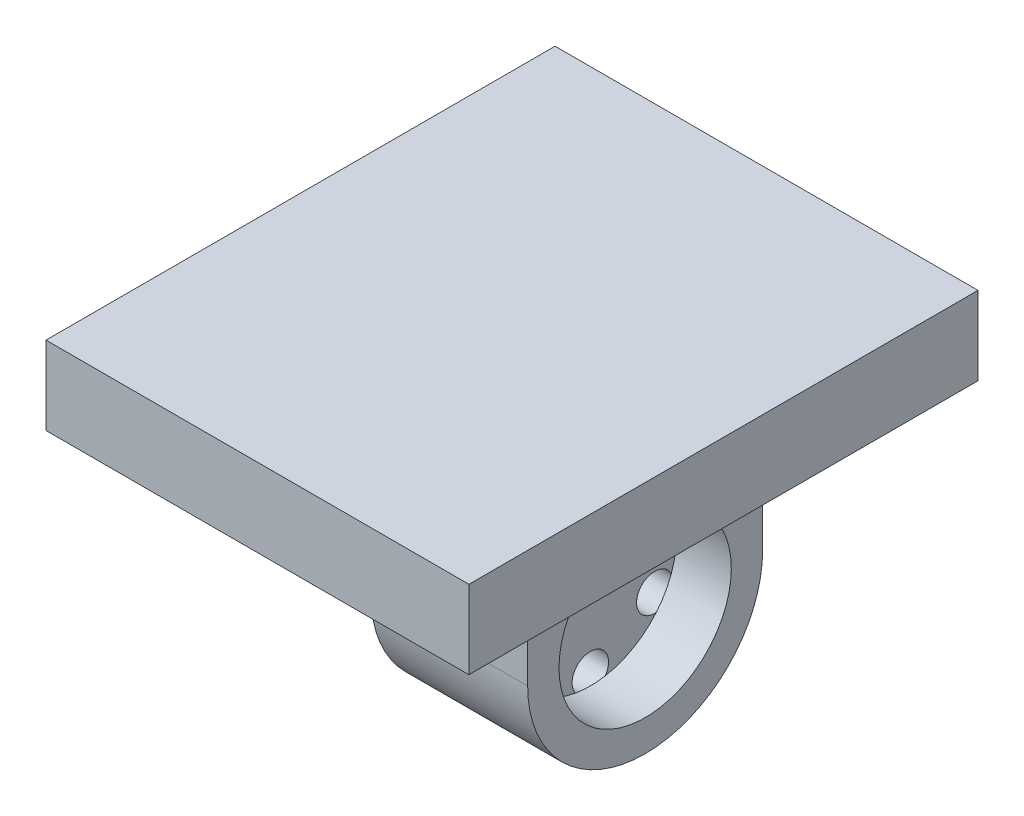
ISO-10303-21;
HEADER;
FILE_DESCRIPTION(('STEP AP214'),'2;1');
FILE_NAME('part.step','',(''),(''),'','','');
FILE_SCHEMA(('AUTOMOTIVE_DESIGN { 1 0 10303 214 1 1 1 1 }'));
ENDSEC;
DATA;
#1=APPLICATION_CONTEXT('core data for automotive mechanical design processes');
#2=APPLICATION_PROTOCOL_DEFINITION('international standard','automotive_design',2000,#1);
#3=PRODUCT_CONTEXT('',#1,'mechanical');
#4=PRODUCT('Part','Part','',(#3));
#5=PRODUCT_RELATED_PRODUCT_CATEGORY('part','',(#4));
#6=PRODUCT_DEFINITION_FORMATION('','',#4);
#7=PRODUCT_DEFINITION_CONTEXT('part definition',#1,'design');
#8=PRODUCT_DEFINITION('design','',#6,#7);
#9=PRODUCT_DEFINITION_SHAPE('','',#8);
#10=(LENGTH_UNIT() NAMED_UNIT(*) SI_UNIT(.MILLI.,.METRE.));
#11=(NAMED_UNIT(*) PLANE_ANGLE_UNIT() SI_UNIT($,.RADIAN.));
#12=(NAMED_UNIT(*) SI_UNIT($,.STERADIAN.) SOLID_ANGLE_UNIT());
#13=UNCERTAINTY_MEASURE_WITH_UNIT(LENGTH_MEASURE(1.E-05),#10,'distance_accuracy_value','');
#14=(GEOMETRIC_REPRESENTATION_CONTEXT(3) GLOBAL_UNCERTAINTY_ASSIGNED_CONTEXT((#13)) GLOBAL_UNIT_ASSIGNED_CONTEXT((#10,
#11,#12)) REPRESENTATION_CONTEXT('',''));
#15=CARTESIAN_POINT('',(0.,0.,0.));
#16=DIRECTION('',(0.,0.,1.));
#17=DIRECTION('',(1.,0.,0.));
#18=AXIS2_PLACEMENT_3D('',#15,#16,#17);
#19=CARTESIAN_POINT('',(0.,0.,0.));
#20=DIRECTION('',(0.,-1.,0.));
#21=DIRECTION('',(0.,0.,-1.));
#22=AXIS2_PLACEMENT_3D('',#19,#20,#21);
#23=PLANE('',#22);
#24=DIRECTION('',(0.,0.,-1.));
#25=VECTOR('',#24,1.);
#26=CARTESIAN_POINT('',(27.,0.,32.5));
#27=LINE('',#26,#25);
#28=CARTESIAN_POINT('',(27.,0.,32.5));
#29=VERTEX_POINT('',#28);
#30=CARTESIAN_POINT('',(27.,0.,-32.5));
#31=VERTEX_POINT('',#30);
#32=EDGE_CURVE('E281',#29,#31,#27,.T.);
#33=ORIENTED_EDGE('',*,*,#32,.F.);
#34=DIRECTION('',(1.,0.,0.));
#35=VECTOR('',#34,1.);
#36=CARTESIAN_POINT('',(-27.,0.,32.5));
#37=LINE('',#36,#35);
#38=CARTESIAN_POINT('',(-27.,0.,32.5));
#39=VERTEX_POINT('',#38);
#40=EDGE_CURVE('E291',#39,#29,#37,.T.);
#41=ORIENTED_EDGE('',*,*,#40,.F.);
#42=DIRECTION('',(0.,0.,1.));
#43=VECTOR('',#42,1.);
#44=CARTESIAN_POINT('',(-27.,0.,32.5));
#45=LINE('',#44,#43);
#46=CARTESIAN_POINT('',(-27.,0.,-32.5));
#47=VERTEX_POINT('',#46);
#48=EDGE_CURVE('E302',#47,#39,#45,.T.);
#49=ORIENTED_EDGE('',*,*,#48,.F.);
#50=DIRECTION('',(-1.,0.,0.));
#51=VECTOR('',#50,1.);
#52=CARTESIAN_POINT('',(-27.,0.,-32.5));
#53=LINE('',#52,#51);
#54=EDGE_CURVE('E300',#31,#47,#53,.T.);
#55=ORIENTED_EDGE('',*,*,#54,.F.);
#56=EDGE_LOOP('',(#33,#41,#49,#55));
#57=FACE_BOUND('',#56,.T.);
#58=DIRECTION('',(0.,0.,-1.));
#59=VECTOR('',#58,1.);
#60=CARTESIAN_POINT('',(-3.00000000000001,0.,15.));
#61=LINE('',#60,#59);
#62=CARTESIAN_POINT('',(-3.00000000000001,0.,15.));
#63=VERTEX_POINT('',#62);
#64=CARTESIAN_POINT('',(-3.,0.,-15.));
#65=VERTEX_POINT('',#64);
#66=EDGE_CURVE('E273',#63,#65,#61,.T.);
#67=ORIENTED_EDGE('',*,*,#66,.F.);
#68=DIRECTION('',(-1.,0.,0.));
#69=VECTOR('',#68,1.);
#70=CARTESIAN_POINT('',(-3.00000000000001,0.,15.));
#71=LINE('',#70,#69);
#72=CARTESIAN_POINT('',(17.,0.,15.));
#73=VERTEX_POINT('',#72);
#74=EDGE_CURVE('E328',#73,#63,#71,.T.);
#75=ORIENTED_EDGE('',*,*,#74,.F.);
#76=DIRECTION('',(0.,0.,1.));
#77=VECTOR('',#76,1.);
#78=CARTESIAN_POINT('',(17.,0.,15.));
#79=LINE('',#78,#77);
#80=CARTESIAN_POINT('',(17.,0.,-15.));
#81=VERTEX_POINT('',#80);
#82=EDGE_CURVE('E433',#81,#73,#79,.T.);
#83=ORIENTED_EDGE('',*,*,#82,.F.);
#84=DIRECTION('',(1.,0.,0.));
#85=VECTOR('',#84,1.);
#86=CARTESIAN_POINT('',(-3.,0.,-15.));
#87=LINE('',#86,#85);
#88=EDGE_CURVE('E428',#65,#81,#87,.T.);
#89=ORIENTED_EDGE('',*,*,#88,.F.);
#90=EDGE_LOOP('',(#67,#75,#83,#89));
#91=FACE_BOUND('',#90,.T.);
#92=ADVANCED_FACE('F34',(#57,#91),#23,.T.);
#93=CARTESIAN_POINT('',(27.,10.,32.5));
#94=DIRECTION('',(-1.,0.,0.));
#95=DIRECTION('',(0.,0.,1.));
#96=AXIS2_PLACEMENT_3D('',#93,#94,#95);
#97=PLANE('',#96);
#98=ORIENTED_EDGE('',*,*,#32,.T.);
#99=DIRECTION('',(0.,-1.,0.));
#100=VECTOR('',#99,1.);
#101=CARTESIAN_POINT('',(27.,10.,-32.5));
#102=LINE('',#101,#100);
#103=CARTESIAN_POINT('',(27.,10.,-32.5));
#104=VERTEX_POINT('',#103);
#105=EDGE_CURVE('E313',#104,#31,#102,.T.);
#106=ORIENTED_EDGE('',*,*,#105,.F.);
#107=DIRECTION('',(0.,0.,-1.));
#108=VECTOR('',#107,1.);
#109=CARTESIAN_POINT('',(27.,10.,32.5));
#110=LINE('',#109,#108);
#111=CARTESIAN_POINT('',(27.,10.,32.5));
#112=VERTEX_POINT('',#111);
#113=EDGE_CURVE('E287',#112,#104,#110,.T.);
#114=ORIENTED_EDGE('',*,*,#113,.F.);
#115=DIRECTION('',(0.,-1.,0.));
#116=VECTOR('',#115,1.);
#117=CARTESIAN_POINT('',(27.,10.,32.5));
#118=LINE('',#117,#116);
#119=EDGE_CURVE('E297',#112,#29,#118,.T.);
#120=ORIENTED_EDGE('',*,*,#119,.T.);
#121=EDGE_LOOP('',(#98,#106,#114,#120));
#122=FACE_BOUND('',#121,.T.);
#123=ADVANCED_FACE('F389',(#122),#97,.F.);
#124=CARTESIAN_POINT('',(-27.,10.,-32.5));
#125=DIRECTION('',(0.,0.,1.));
#126=DIRECTION('',(1.,0.,0.));
#127=AXIS2_PLACEMENT_3D('',#124,#125,#126);
#128=PLANE('',#127);
#129=ORIENTED_EDGE('',*,*,#54,.T.);
#130=DIRECTION('',(0.,-1.,0.));
#131=VECTOR('',#130,1.);
#132=CARTESIAN_POINT('',(-27.,10.,-32.5));
#133=LINE('',#132,#131);
#134=CARTESIAN_POINT('',(-27.,10.,-32.5));
#135=VERTEX_POINT('',#134);
#136=EDGE_CURVE('E310',#135,#47,#133,.T.);
#137=ORIENTED_EDGE('',*,*,#136,.F.);
#138=DIRECTION('',(-1.,0.,0.));
#139=VECTOR('',#138,1.);
#140=CARTESIAN_POINT('',(-27.,10.,-32.5));
#141=LINE('',#140,#139);
#142=EDGE_CURVE('E290',#104,#135,#141,.T.);
#143=ORIENTED_EDGE('',*,*,#142,.F.);
#144=ORIENTED_EDGE('',*,*,#105,.T.);
#145=EDGE_LOOP('',(#129,#137,#143,#144));
#146=FACE_BOUND('',#145,.T.);
#147=ADVANCED_FACE('F395',(#146),#128,.F.);
#148=CARTESIAN_POINT('',(-27.,10.,32.5));
#149=DIRECTION('',(1.,0.,0.));
#150=DIRECTION('',(0.,0.,-1.));
#151=AXIS2_PLACEMENT_3D('',#148,#149,#150);
#152=PLANE('',#151);
#153=ORIENTED_EDGE('',*,*,#48,.T.);
#154=DIRECTION('',(0.,-1.,0.));
#155=VECTOR('',#154,1.);
#156=CARTESIAN_POINT('',(-27.,10.,32.5));
#157=LINE('',#156,#155);
#158=CARTESIAN_POINT('',(-27.,10.,32.5));
#159=VERTEX_POINT('',#158);
#160=EDGE_CURVE('E307',#159,#39,#157,.T.);
#161=ORIENTED_EDGE('',*,*,#160,.F.);
#162=DIRECTION('',(0.,0.,1.));
#163=VECTOR('',#162,1.);
#164=CARTESIAN_POINT('',(-27.,10.,32.5));
#165=LINE('',#164,#163);
#166=EDGE_CURVE('E293',#135,#159,#165,.T.);
#167=ORIENTED_EDGE('',*,*,#166,.F.);
#168=ORIENTED_EDGE('',*,*,#136,.T.);
#169=EDGE_LOOP('',(#153,#161,#167,#168));
#170=FACE_BOUND('',#169,.T.);
#171=ADVANCED_FACE('F407',(#170),#152,.F.);
#172=CARTESIAN_POINT('',(-27.,10.,32.5));
#173=DIRECTION('',(0.,0.,-1.));
#174=DIRECTION('',(-1.,0.,0.));
#175=AXIS2_PLACEMENT_3D('',#172,#173,#174);
#176=PLANE('',#175);
#177=ORIENTED_EDGE('',*,*,#40,.T.);
#178=ORIENTED_EDGE('',*,*,#119,.F.);
#179=DIRECTION('',(1.,0.,0.));
#180=VECTOR('',#179,1.);
#181=CARTESIAN_POINT('',(-27.,10.,32.5));
#182=LINE('',#181,#180);
#183=EDGE_CURVE('E295',#159,#112,#182,.T.);
#184=ORIENTED_EDGE('',*,*,#183,.F.);
#185=ORIENTED_EDGE('',*,*,#160,.T.);
#186=EDGE_LOOP('',(#177,#178,#184,#185));
#187=FACE_BOUND('',#186,.T.);
#188=ADVANCED_FACE('F404',(#187),#176,.F.);
#189=CARTESIAN_POINT('',(0.,10.,0.));
#190=DIRECTION('',(0.,-1.,0.));
#191=DIRECTION('',(0.,0.,-1.));
#192=AXIS2_PLACEMENT_3D('',#189,#190,#191);
#193=PLANE('',#192);
#194=ORIENTED_EDGE('',*,*,#113,.T.);
#195=ORIENTED_EDGE('',*,*,#142,.T.);
#196=ORIENTED_EDGE('',*,*,#166,.T.);
#197=ORIENTED_EDGE('',*,*,#183,.T.);
#198=EDGE_LOOP('',(#194,#195,#196,#197));
#199=FACE_BOUND('',#198,.T.);
#200=ADVANCED_FACE('F402',(#199),#193,.F.);
#201=CARTESIAN_POINT('',(-3.00000000000001,-30.,15.));
#202=DIRECTION('',(0.,0.,-1.));
#203=DIRECTION('',(-1.,0.,0.));
#204=AXIS2_PLACEMENT_3D('',#201,#202,#203);
#205=PLANE('',#204);
#206=DIRECTION('',(0.,1.,0.));
#207=VECTOR('',#206,1.);
#208=CARTESIAN_POINT('',(-3.00000000000001,-30.,15.));
#209=LINE('',#208,#207);
#210=CARTESIAN_POINT('',(-3.00000000000001,-15.,15.));
#211=VERTEX_POINT('',#210);
#212=EDGE_CURVE('E278',#211,#63,#209,.T.);
#213=ORIENTED_EDGE('',*,*,#212,.F.);
#214=DIRECTION('',(-1.,0.,0.));
#215=VECTOR('',#214,1.);
#216=CARTESIAN_POINT('',(-3.00000000000001,-15.,15.));
#217=LINE('',#216,#215);
#218=CARTESIAN_POINT('',(17.,-15.,15.));
#219=VERTEX_POINT('',#218);
#220=EDGE_CURVE('E325',#211,#219,#217,.F.);
#221=ORIENTED_EDGE('',*,*,#220,.T.);
#222=DIRECTION('',(0.,1.,0.));
#223=VECTOR('',#222,1.);
#224=CARTESIAN_POINT('',(17.,-30.,15.));
#225=LINE('',#224,#223);
#226=EDGE_CURVE('E283',#219,#73,#225,.T.);
#227=ORIENTED_EDGE('',*,*,#226,.T.);
#228=ORIENTED_EDGE('',*,*,#74,.T.);
#229=EDGE_LOOP('',(#213,#221,#227,#228));
#230=FACE_BOUND('',#229,.T.);
#231=ADVANCED_FACE('F264',(#230),#205,.F.);
#232=CARTESIAN_POINT('',(-3.00000000000001,-30.,15.));
#233=DIRECTION('',(1.,0.,0.));
#234=DIRECTION('',(0.,0.,-1.));
#235=AXIS2_PLACEMENT_3D('',#232,#233,#234);
#236=PLANE('',#235);
#237=CARTESIAN_POINT('',(-3.,-10.2500000000003,-8.22724133595191));
#238=DIRECTION('',(-1.,0.,0.));
#239=DIRECTION('',(0.,0.,1.));
#240=AXIS2_PLACEMENT_3D('',#237,#238,#239);
#241=CIRCLE('',#240,1.5875);
#242=CARTESIAN_POINT('',(-3.,-10.2500000000003,-6.63974133595191));
#243=VERTEX_POINT('',#242);
#244=EDGE_CURVE('E235',#243,#243,#241,.T.);
#245=ORIENTED_EDGE('',*,*,#244,.F.);
#246=EDGE_LOOP('',(#245));
#247=FACE_BOUND('',#246,.T.);
#248=CARTESIAN_POINT('',(-3.,-19.7500000000003,-8.22724133595161));
#249=DIRECTION('',(-1.,0.,0.));
#250=DIRECTION('',(0.,0.,1.));
#251=AXIS2_PLACEMENT_3D('',#248,#249,#250);
#252=CIRCLE('',#251,1.5875);
#253=CARTESIAN_POINT('',(-3.,-19.7500000000003,-6.63974133595161));
#254=VERTEX_POINT('',#253);
#255=EDGE_CURVE('E238',#254,#254,#252,.T.);
#256=ORIENTED_EDGE('',*,*,#255,.F.);
#257=EDGE_LOOP('',(#256));
#258=FACE_BOUND('',#257,.T.);
#259=CARTESIAN_POINT('',(-3.,-24.5,7.40190329950925E-13));
#260=DIRECTION('',(-1.,0.,0.));
#261=DIRECTION('',(0.,0.,1.));
#262=AXIS2_PLACEMENT_3D('',#259,#260,#261);
#263=CIRCLE('',#262,1.5875);
#264=CARTESIAN_POINT('',(-3.,-24.5,1.58750000000074));
#265=VERTEX_POINT('',#264);
#266=EDGE_CURVE('E241',#265,#265,#263,.T.);
#267=ORIENTED_EDGE('',*,*,#266,.F.);
#268=EDGE_LOOP('',(#267));
#269=FACE_BOUND('',#268,.T.);
#270=CARTESIAN_POINT('',(-3.,-19.7499999999997,8.22724133595275));
#271=DIRECTION('',(-1.,0.,0.));
#272=DIRECTION('',(0.,0.,1.));
#273=AXIS2_PLACEMENT_3D('',#270,#271,#272);
#274=CIRCLE('',#273,1.5875);
#275=CARTESIAN_POINT('',(-3.,-19.7499999999997,9.81474133595275));
#276=VERTEX_POINT('',#275);
#277=EDGE_CURVE('E244',#276,#276,#274,.T.);
#278=ORIENTED_EDGE('',*,*,#277,.F.);
#279=EDGE_LOOP('',(#278));
#280=FACE_BOUND('',#279,.T.);
#281=CARTESIAN_POINT('',(-3.,-10.2499999999997,8.22724133595238));
#282=DIRECTION('',(-1.,0.,0.));
#283=DIRECTION('',(0.,0.,1.));
#284=AXIS2_PLACEMENT_3D('',#281,#282,#283);
#285=CIRCLE('',#284,1.5875);
#286=CARTESIAN_POINT('',(-3.,-10.2499999999997,9.81474133595238));
#287=VERTEX_POINT('',#286);
#288=EDGE_CURVE('E247',#287,#287,#285,.T.);
#289=ORIENTED_EDGE('',*,*,#288,.F.);
#290=EDGE_LOOP('',(#289));
#291=FACE_BOUND('',#290,.T.);
#292=CARTESIAN_POINT('',(-3.,-5.5,0.));
#293=DIRECTION('',(-1.,0.,0.));
#294=DIRECTION('',(0.,0.,1.));
#295=AXIS2_PLACEMENT_3D('',#292,#293,#294);
#296=CIRCLE('',#295,1.5875);
#297=CARTESIAN_POINT('',(-3.,-5.5,1.5875));
#298=VERTEX_POINT('',#297);
#299=EDGE_CURVE('E250',#298,#298,#296,.T.);
#300=ORIENTED_EDGE('',*,*,#299,.F.);
#301=EDGE_LOOP('',(#300));
#302=FACE_BOUND('',#301,.T.);
#303=CARTESIAN_POINT('',(-3.,-15.,0.));
#304=DIRECTION('',(-1.,0.,0.));
#305=DIRECTION('',(0.,0.,1.));
#306=AXIS2_PLACEMENT_3D('',#303,#304,#305);
#307=CIRCLE('',#306,6.);
#308=CARTESIAN_POINT('',(-3.,-15.,6.));
#309=VERTEX_POINT('',#308);
#310=EDGE_CURVE('E253',#309,#309,#307,.T.);
#311=ORIENTED_EDGE('',*,*,#310,.F.);
#312=EDGE_LOOP('',(#311));
#313=FACE_BOUND('',#312,.T.);
#314=DIRECTION('',(0.,1.,0.));
#315=VECTOR('',#314,1.);
#316=CARTESIAN_POINT('',(-3.,-30.,-15.));
#317=LINE('',#316,#315);
#318=CARTESIAN_POINT('',(-3.,-15.,-15.));
#319=VERTEX_POINT('',#318);
#320=EDGE_CURVE('E269',#319,#65,#317,.T.);
#321=ORIENTED_EDGE('',*,*,#320,.F.);
#322=CARTESIAN_POINT('',(-3.,-15.,0.));
#323=DIRECTION('',(1.,0.,0.));
#324=DIRECTION('',(0.,0.,-1.));
#325=AXIS2_PLACEMENT_3D('',#322,#323,#324);
#326=CIRCLE('',#325,15.);
#327=CARTESIAN_POINT('',(-3.,-30.,0.));
#328=VERTEX_POINT('',#327);
#329=EDGE_CURVE('E270',#319,#328,#326,.F.);
#330=ORIENTED_EDGE('',*,*,#329,.T.);
#331=CARTESIAN_POINT('',(-3.,-15.,0.));
#332=DIRECTION('',(1.,0.,0.));
#333=DIRECTION('',(0.,0.,-1.));
#334=AXIS2_PLACEMENT_3D('',#331,#332,#333);
#335=CIRCLE('',#334,15.);
#336=EDGE_CURVE('E322',#328,#211,#335,.F.);
#337=ORIENTED_EDGE('',*,*,#336,.T.);
#338=ORIENTED_EDGE('',*,*,#212,.T.);
#339=ORIENTED_EDGE('',*,*,#66,.T.);
#340=EDGE_LOOP('',(#321,#330,#337,#338,#339));
#341=FACE_BOUND('',#340,.T.);
#342=ADVANCED_FACE('F260',(#247,#258,#269,#280,#291,#302,#313,#341),#236,.F.);
#343=CARTESIAN_POINT('',(-3.,-30.,-15.));
#344=DIRECTION('',(0.,0.,1.));
#345=DIRECTION('',(1.,0.,0.));
#346=AXIS2_PLACEMENT_3D('',#343,#344,#345);
#347=PLANE('',#346);
#348=DIRECTION('',(0.,1.,0.));
#349=VECTOR('',#348,1.);
#350=CARTESIAN_POINT('',(17.,-30.,-15.));
#351=LINE('',#350,#349);
#352=CARTESIAN_POINT('',(17.,-15.,-15.));
#353=VERTEX_POINT('',#352);
#354=EDGE_CURVE('E279',#353,#81,#351,.T.);
#355=ORIENTED_EDGE('',*,*,#354,.F.);
#356=DIRECTION('',(1.,0.,0.));
#357=VECTOR('',#356,1.);
#358=CARTESIAN_POINT('',(-3.,-15.,-15.));
#359=LINE('',#358,#357);
#360=EDGE_CURVE('E320',#353,#319,#359,.F.);
#361=ORIENTED_EDGE('',*,*,#360,.T.);
#362=ORIENTED_EDGE('',*,*,#320,.T.);
#363=ORIENTED_EDGE('',*,*,#88,.T.);
#364=EDGE_LOOP('',(#355,#361,#362,#363));
#365=FACE_BOUND('',#364,.T.);
#366=ADVANCED_FACE('F263',(#365),#347,.F.);
#367=CARTESIAN_POINT('',(17.,-30.,15.));
#368=DIRECTION('',(-1.,0.,0.));
#369=DIRECTION('',(0.,0.,1.));
#370=AXIS2_PLACEMENT_3D('',#367,#368,#369);
#371=PLANE('',#370);
#372=CARTESIAN_POINT('',(17.,-15.,0.));
#373=DIRECTION('',(1.,0.,0.));
#374=DIRECTION('',(0.,0.,-1.));
#375=AXIS2_PLACEMENT_3D('',#372,#373,#374);
#376=CIRCLE('',#375,11.);
#377=CARTESIAN_POINT('',(17.,-15.,-11.));
#378=VERTEX_POINT('',#377);
#379=EDGE_CURVE('E178',#378,#378,#376,.T.);
#380=ORIENTED_EDGE('',*,*,#379,.F.);
#381=EDGE_LOOP('',(#380));
#382=FACE_BOUND('',#381,.T.);
#383=CARTESIAN_POINT('',(17.,-15.,0.));
#384=DIRECTION('',(-1.,0.,0.));
#385=DIRECTION('',(0.,0.,1.));
#386=AXIS2_PLACEMENT_3D('',#383,#384,#385);
#387=CIRCLE('',#386,15.);
#388=CARTESIAN_POINT('',(17.,-30.,0.));
#389=VERTEX_POINT('',#388);
#390=EDGE_CURVE('E316',#219,#389,#387,.F.);
#391=ORIENTED_EDGE('',*,*,#390,.T.);
#392=CARTESIAN_POINT('',(17.,-15.,0.));
#393=DIRECTION('',(-1.,0.,0.));
#394=DIRECTION('',(0.,0.,1.));
#395=AXIS2_PLACEMENT_3D('',#392,#393,#394);
#396=CIRCLE('',#395,15.);
#397=EDGE_CURVE('E318',#389,#353,#396,.F.);
#398=ORIENTED_EDGE('',*,*,#397,.T.);
#399=ORIENTED_EDGE('',*,*,#354,.T.);
#400=ORIENTED_EDGE('',*,*,#82,.T.);
#401=ORIENTED_EDGE('',*,*,#226,.F.);
#402=EDGE_LOOP('',(#391,#398,#399,#400,#401));
#403=FACE_BOUND('',#402,.T.);
#404=ADVANCED_FACE('F422',(#382,#403),#371,.F.);
#405=CARTESIAN_POINT('',(0.,-15.,0.));
#406=DIRECTION('',(-1.,0.,0.));
#407=DIRECTION('',(0.,0.,1.));
#408=AXIS2_PLACEMENT_3D('',#405,#406,#407);
#409=CYLINDRICAL_SURFACE('',#408,15.);
#410=ORIENTED_EDGE('',*,*,#220,.F.);
#411=ORIENTED_EDGE('',*,*,#336,.F.);
#412=DIRECTION('',(-1.,0.,0.));
#413=VECTOR('',#412,1.);
#414=CARTESIAN_POINT('',(0.,-30.,0.));
#415=LINE('',#414,#413);
#416=EDGE_CURVE('E166',#389,#328,#415,.T.);
#417=ORIENTED_EDGE('',*,*,#416,.F.);
#418=ORIENTED_EDGE('',*,*,#390,.F.);
#419=EDGE_LOOP('',(#410,#411,#417,#418));
#420=FACE_BOUND('',#419,.T.);
#421=ADVANCED_FACE('F36',(#420),#409,.T.);
#422=CARTESIAN_POINT('',(0.,-15.,0.));
#423=DIRECTION('',(1.,0.,0.));
#424=DIRECTION('',(0.,0.,-1.));
#425=AXIS2_PLACEMENT_3D('',#422,#423,#424);
#426=CYLINDRICAL_SURFACE('',#425,15.);
#427=ORIENTED_EDGE('',*,*,#329,.F.);
#428=ORIENTED_EDGE('',*,*,#360,.F.);
#429=ORIENTED_EDGE('',*,*,#397,.F.);
#430=ORIENTED_EDGE('',*,*,#416,.T.);
#431=EDGE_LOOP('',(#427,#428,#429,#430));
#432=FACE_BOUND('',#431,.T.);
#433=ADVANCED_FACE('F414',(#432),#426,.T.);
#434=CARTESIAN_POINT('',(10.,-15.,0.));
#435=DIRECTION('',(1.,0.,0.));
#436=DIRECTION('',(0.,0.,-1.));
#437=AXIS2_PLACEMENT_3D('',#434,#435,#436);
#438=CYLINDRICAL_SURFACE('',#437,11.);
#439=CARTESIAN_POINT('',(10.,-15.,0.));
#440=DIRECTION('',(1.,0.,0.));
#441=DIRECTION('',(0.,0.,-1.));
#442=AXIS2_PLACEMENT_3D('',#439,#440,#441);
#443=CIRCLE('',#442,11.);
#444=CARTESIAN_POINT('',(10.,-4.16586530578947,-1.90303059032265));
#445=VERTEX_POINT('',#444);
#446=CARTESIAN_POINT('',(10.,-4.16586530578947,1.90303059032265));
#447=VERTEX_POINT('',#446);
#448=EDGE_CURVE('E163',#445,#447,#443,.T.);
#449=ORIENTED_EDGE('',*,*,#448,.F.);
#450=CARTESIAN_POINT('',(10.,-7.93485981749605,-8.43112057804702));
#451=VERTEX_POINT('',#450);
#452=EDGE_CURVE('E171',#451,#445,#443,.T.);
#453=ORIENTED_EDGE('',*,*,#452,.F.);
#454=CARTESIAN_POINT('',(10.,-11.2310054882931,-10.33415116837));
#455=VERTEX_POINT('',#454);
#456=EDGE_CURVE('E164',#455,#451,#443,.T.);
#457=ORIENTED_EDGE('',*,*,#456,.F.);
#458=CARTESIAN_POINT('',(10.,-18.7689945117061,-10.3341511683703));
#459=VERTEX_POINT('',#458);
#460=EDGE_CURVE('E170',#459,#455,#443,.T.);
#461=ORIENTED_EDGE('',*,*,#460,.F.);
#462=CARTESIAN_POINT('',(10.,-22.0651401825033,-8.43112057804757));
#463=VERTEX_POINT('',#462);
#464=EDGE_CURVE('E176',#463,#459,#443,.T.);
#465=ORIENTED_EDGE('',*,*,#464,.F.);
#466=CARTESIAN_POINT('',(10.,-25.8341346942104,-1.9030305903235));
#467=VERTEX_POINT('',#466);
#468=EDGE_CURVE('E183',#467,#463,#443,.T.);
#469=ORIENTED_EDGE('',*,*,#468,.F.);
#470=CARTESIAN_POINT('',(10.,-25.8341346942107,1.90303059032182));
#471=VERTEX_POINT('',#470);
#472=EDGE_CURVE('E177',#471,#467,#443,.T.);
#473=ORIENTED_EDGE('',*,*,#472,.F.);
#474=CARTESIAN_POINT('',(10.,-22.0651401825038,8.43112057804714));
#475=VERTEX_POINT('',#474);
#476=EDGE_CURVE('E158',#475,#471,#443,.T.);
#477=ORIENTED_EDGE('',*,*,#476,.F.);
#478=CARTESIAN_POINT('',(10.,-18.7689945117078,10.3341511683697));
#479=VERTEX_POINT('',#478);
#480=EDGE_CURVE('E188',#479,#475,#443,.T.);
#481=ORIENTED_EDGE('',*,*,#480,.F.);
#482=CARTESIAN_POINT('',(10.,-11.2310054882929,10.3341511683699));
#483=VERTEX_POINT('',#482);
#484=EDGE_CURVE('E156',#483,#479,#443,.T.);
#485=ORIENTED_EDGE('',*,*,#484,.F.);
#486=CARTESIAN_POINT('',(10.,-7.93485981749672,8.4311205780476));
#487=VERTEX_POINT('',#486);
#488=EDGE_CURVE('E146',#487,#483,#443,.T.);
#489=ORIENTED_EDGE('',*,*,#488,.F.);
#490=EDGE_CURVE('E154',#447,#487,#443,.T.);
#491=ORIENTED_EDGE('',*,*,#490,.F.);
#492=EDGE_LOOP('',(#449,#453,#457,#461,#465,#469,#473,#477,#481,#485,#489,#491));
#493=FACE_BOUND('',#492,.T.);
#494=ORIENTED_EDGE('',*,*,#379,.T.);
#495=EDGE_LOOP('',(#494));
#496=FACE_BOUND('',#495,.T.);
#497=ADVANCED_FACE('F152',(#493,#496),#438,.F.);
#498=CARTESIAN_POINT('',(10.,-15.,0.));
#499=DIRECTION('',(1.,0.,0.));
#500=DIRECTION('',(0.,0.,-1.));
#501=AXIS2_PLACEMENT_3D('',#498,#499,#500);
#502=PLANE('',#501);
#503=CARTESIAN_POINT('',(10.,-10.2500000000003,8.22724133595191));
#504=DIRECTION('',(1.,0.,0.));
#505=DIRECTION('',(0.,0.,-1.));
#506=AXIS2_PLACEMENT_3D('',#503,#504,#505);
#507=CIRCLE('',#506,2.3241);
#508=EDGE_CURVE('E11',#483,#487,#507,.T.);
#509=ORIENTED_EDGE('',*,*,#508,.F.);
#510=ORIENTED_EDGE('',*,*,#484,.T.);
#511=CARTESIAN_POINT('',(10.,-19.7500000000003,8.22724133595161));
#512=DIRECTION('',(1.,0.,0.));
#513=DIRECTION('',(0.,0.,-1.));
#514=AXIS2_PLACEMENT_3D('',#511,#512,#513);
#515=CIRCLE('',#514,2.3241);
#516=EDGE_CURVE('E42',#475,#479,#515,.T.);
#517=ORIENTED_EDGE('',*,*,#516,.F.);
#518=ORIENTED_EDGE('',*,*,#476,.T.);
#519=CARTESIAN_POINT('',(10.,-24.5,-7.35983625521681E-13));
#520=DIRECTION('',(1.,0.,0.));
#521=DIRECTION('',(0.,0.,-1.));
#522=AXIS2_PLACEMENT_3D('',#519,#520,#521);
#523=CIRCLE('',#522,2.3241);
#524=EDGE_CURVE('E196',#467,#471,#523,.T.);
#525=ORIENTED_EDGE('',*,*,#524,.F.);
#526=ORIENTED_EDGE('',*,*,#468,.T.);
#527=CARTESIAN_POINT('',(10.,-19.7499999999997,-8.22724133595274));
#528=DIRECTION('',(1.,0.,0.));
#529=DIRECTION('',(0.,0.,-1.));
#530=AXIS2_PLACEMENT_3D('',#527,#528,#529);
#531=CIRCLE('',#530,2.3241);
#532=EDGE_CURVE('E212',#459,#463,#531,.T.);
#533=ORIENTED_EDGE('',*,*,#532,.F.);
#534=ORIENTED_EDGE('',*,*,#460,.T.);
#535=CARTESIAN_POINT('',(10.,-10.2499999999997,-8.22724133595238));
#536=DIRECTION('',(1.,0.,0.));
#537=DIRECTION('',(0.,0.,-1.));
#538=AXIS2_PLACEMENT_3D('',#535,#536,#537);
#539=CIRCLE('',#538,2.3241);
#540=EDGE_CURVE('E210',#451,#455,#539,.T.);
#541=ORIENTED_EDGE('',*,*,#540,.F.);
#542=ORIENTED_EDGE('',*,*,#452,.T.);
#543=CARTESIAN_POINT('',(10.,-5.5,0.));
#544=DIRECTION('',(1.,0.,0.));
#545=DIRECTION('',(0.,0.,-1.));
#546=AXIS2_PLACEMENT_3D('',#543,#544,#545);
#547=CIRCLE('',#546,2.3241);
#548=EDGE_CURVE('E162',#447,#445,#547,.T.);
#549=ORIENTED_EDGE('',*,*,#548,.F.);
#550=ORIENTED_EDGE('',*,*,#490,.T.);
#551=EDGE_LOOP('',(#509,#510,#517,#518,#525,#526,#533,#534,#541,#542,#549,#550));
#552=FACE_BOUND('',#551,.T.);
#553=ADVANCED_FACE('F160',(#552),#502,.T.);
#554=CARTESIAN_POINT('',(2.,-15.,0.));
#555=DIRECTION('',(-1.,0.,0.));
#556=DIRECTION('',(0.,0.,1.));
#557=AXIS2_PLACEMENT_3D('',#554,#555,#556);
#558=CYLINDRICAL_SURFACE('',#557,6.);
#559=CARTESIAN_POINT('',(2.,-15.,0.));
#560=DIRECTION('',(-1.,0.,0.));
#561=DIRECTION('',(0.,0.,1.));
#562=AXIS2_PLACEMENT_3D('',#559,#560,#561);
#563=CIRCLE('',#562,6.);
#564=CARTESIAN_POINT('',(2.,-15.,6.));
#565=VERTEX_POINT('',#564);
#566=EDGE_CURVE('E181',#565,#565,#563,.T.);
#567=ORIENTED_EDGE('',*,*,#566,.F.);
#568=EDGE_LOOP('',(#567));
#569=FACE_BOUND('',#568,.T.);
#570=ORIENTED_EDGE('',*,*,#310,.T.);
#571=EDGE_LOOP('',(#570));
#572=FACE_BOUND('',#571,.T.);
#573=ADVANCED_FACE('F258',(#569,#572),#558,.F.);
#574=CARTESIAN_POINT('',(2.,-15.,0.));
#575=DIRECTION('',(-1.,0.,0.));
#576=DIRECTION('',(0.,0.,1.));
#577=AXIS2_PLACEMENT_3D('',#574,#575,#576);
#578=PLANE('',#577);
#579=ORIENTED_EDGE('',*,*,#566,.T.);
#580=EDGE_LOOP('',(#579));
#581=FACE_BOUND('',#580,.T.);
#582=ADVANCED_FACE('F375',(#581),#578,.T.);
#583=CARTESIAN_POINT('',(3.99999999999999,-5.5,0.));
#584=DIRECTION('',(-1.,0.,0.));
#585=DIRECTION('',(0.,0.,1.));
#586=AXIS2_PLACEMENT_3D('',#583,#584,#585);
#587=CYLINDRICAL_SURFACE('',#586,1.5875);
#588=CARTESIAN_POINT('',(4.00000000000001,-5.5,0.));
#589=DIRECTION('',(1.,0.,0.));
#590=DIRECTION('',(0.,0.,-1.));
#591=AXIS2_PLACEMENT_3D('',#588,#589,#590);
#592=CIRCLE('',#591,1.5875);
#593=CARTESIAN_POINT('',(4.00000000000001,-5.5,-1.5875));
#594=VERTEX_POINT('',#593);
#595=EDGE_CURVE('E231',#594,#594,#592,.F.);
#596=ORIENTED_EDGE('',*,*,#595,.F.);
#597=EDGE_LOOP('',(#596));
#598=FACE_BOUND('',#597,.T.);
#599=ORIENTED_EDGE('',*,*,#299,.T.);
#600=EDGE_LOOP('',(#599));
#601=FACE_BOUND('',#600,.T.);
#602=ADVANCED_FACE('F372',(#598,#601),#587,.F.);
#603=CARTESIAN_POINT('',(3.99999999999999,-10.2499999999997,8.22724133595238));
#604=DIRECTION('',(-1.,0.,0.));
#605=DIRECTION('',(0.,0.,1.));
#606=AXIS2_PLACEMENT_3D('',#603,#604,#605);
#607=CYLINDRICAL_SURFACE('',#606,1.5875);
#608=CARTESIAN_POINT('',(4.,-10.2499999999997,8.22724133595238));
#609=DIRECTION('',(1.,0.,0.));
#610=DIRECTION('',(0.,0.,-1.));
#611=AXIS2_PLACEMENT_3D('',#608,#609,#610);
#612=CIRCLE('',#611,1.5875);
#613=CARTESIAN_POINT('',(4.,-10.2499999999997,6.63974133595238));
#614=VERTEX_POINT('',#613);
#615=EDGE_CURVE('E332',#614,#614,#612,.F.);
#616=ORIENTED_EDGE('',*,*,#615,.F.);
#617=EDGE_LOOP('',(#616));
#618=FACE_BOUND('',#617,.T.);
#619=ORIENTED_EDGE('',*,*,#288,.T.);
#620=EDGE_LOOP('',(#619));
#621=FACE_BOUND('',#620,.T.);
#622=ADVANCED_FACE('F374',(#618,#621),#607,.F.);
#623=CARTESIAN_POINT('',(3.99999999999999,-19.7499999999997,8.22724133595275));
#624=DIRECTION('',(-1.,0.,0.));
#625=DIRECTION('',(0.,0.,1.));
#626=AXIS2_PLACEMENT_3D('',#623,#624,#625);
#627=CYLINDRICAL_SURFACE('',#626,1.5875);
#628=CARTESIAN_POINT('',(4.,-19.7499999999997,8.22724133595275));
#629=DIRECTION('',(1.,0.,0.));
#630=DIRECTION('',(0.,0.,-1.));
#631=AXIS2_PLACEMENT_3D('',#628,#629,#630);
#632=CIRCLE('',#631,1.5875);
#633=CARTESIAN_POINT('',(4.,-19.7499999999997,6.63974133595275));
#634=VERTEX_POINT('',#633);
#635=EDGE_CURVE('E206',#634,#634,#632,.F.);
#636=ORIENTED_EDGE('',*,*,#635,.F.);
#637=EDGE_LOOP('',(#636));
#638=FACE_BOUND('',#637,.T.);
#639=ORIENTED_EDGE('',*,*,#277,.T.);
#640=EDGE_LOOP('',(#639));
#641=FACE_BOUND('',#640,.T.);
#642=ADVANCED_FACE('F382',(#638,#641),#627,.F.);
#643=CARTESIAN_POINT('',(3.99999999999999,-24.5,7.42315366208996E-13));
#644=DIRECTION('',(-1.,0.,0.));
#645=DIRECTION('',(0.,0.,1.));
#646=AXIS2_PLACEMENT_3D('',#643,#644,#645);
#647=CYLINDRICAL_SURFACE('',#646,1.5875);
#648=CARTESIAN_POINT('',(4.00000000000001,-24.5,7.42315366208996E-13));
#649=DIRECTION('',(1.,0.,0.));
#650=DIRECTION('',(0.,0.,-1.));
#651=AXIS2_PLACEMENT_3D('',#648,#649,#650);
#652=CIRCLE('',#651,1.5875);
#653=CARTESIAN_POINT('',(4.00000000000001,-24.5,-1.58749999999926));
#654=VERTEX_POINT('',#653);
#655=EDGE_CURVE('E342',#654,#654,#652,.F.);
#656=ORIENTED_EDGE('',*,*,#655,.F.);
#657=EDGE_LOOP('',(#656));
#658=FACE_BOUND('',#657,.T.);
#659=ORIENTED_EDGE('',*,*,#266,.T.);
#660=EDGE_LOOP('',(#659));
#661=FACE_BOUND('',#660,.T.);
#662=ADVANCED_FACE('F359',(#658,#661),#647,.F.);
#663=CARTESIAN_POINT('',(4.,-19.7500000000003,-8.22724133595161));
#664=DIRECTION('',(-1.,0.,0.));
#665=DIRECTION('',(0.,0.,1.));
#666=AXIS2_PLACEMENT_3D('',#663,#664,#665);
#667=CYLINDRICAL_SURFACE('',#666,1.5875);
#668=CARTESIAN_POINT('',(4.00000000000001,-19.7500000000003,-8.22724133595161));
#669=DIRECTION('',(1.,0.,0.));
#670=DIRECTION('',(0.,0.,-1.));
#671=AXIS2_PLACEMENT_3D('',#668,#669,#670);
#672=CIRCLE('',#671,1.5875);
#673=CARTESIAN_POINT('',(4.00000000000001,-19.7500000000003,-9.81474133595161));
#674=VERTEX_POINT('',#673);
#675=EDGE_CURVE('E216',#674,#674,#672,.F.);
#676=ORIENTED_EDGE('',*,*,#675,.F.);
#677=EDGE_LOOP('',(#676));
#678=FACE_BOUND('',#677,.T.);
#679=ORIENTED_EDGE('',*,*,#255,.T.);
#680=EDGE_LOOP('',(#679));
#681=FACE_BOUND('',#680,.T.);
#682=ADVANCED_FACE('F355',(#678,#681),#667,.F.);
#683=CARTESIAN_POINT('',(4.,-10.2500000000003,-8.22724133595191));
#684=DIRECTION('',(-1.,0.,0.));
#685=DIRECTION('',(0.,0.,1.));
#686=AXIS2_PLACEMENT_3D('',#683,#684,#685);
#687=CYLINDRICAL_SURFACE('',#686,1.5875);
#688=CARTESIAN_POINT('',(4.00000000000001,-10.2500000000003,-8.22724133595191));
#689=DIRECTION('',(1.,0.,0.));
#690=DIRECTION('',(0.,0.,-1.));
#691=AXIS2_PLACEMENT_3D('',#688,#689,#690);
#692=CIRCLE('',#691,1.5875);
#693=CARTESIAN_POINT('',(4.00000000000001,-10.2500000000003,-9.81474133595191));
#694=VERTEX_POINT('',#693);
#695=EDGE_CURVE('E221',#694,#694,#692,.F.);
#696=ORIENTED_EDGE('',*,*,#695,.F.);
#697=EDGE_LOOP('',(#696));
#698=FACE_BOUND('',#697,.T.);
#699=ORIENTED_EDGE('',*,*,#244,.T.);
#700=EDGE_LOOP('',(#699));
#701=FACE_BOUND('',#700,.T.);
#702=ADVANCED_FACE('F358',(#698,#701),#687,.F.);
#703=CARTESIAN_POINT('',(4.00000000000001,-5.5,0.));
#704=DIRECTION('',(1.,0.,0.));
#705=DIRECTION('',(0.,0.,-1.));
#706=AXIS2_PLACEMENT_3D('',#703,#704,#705);
#707=PLANE('',#706);
#708=CARTESIAN_POINT('',(4.00000000000001,-5.5,0.));
#709=DIRECTION('',(1.,0.,0.));
#710=DIRECTION('',(0.,0.,-1.));
#711=AXIS2_PLACEMENT_3D('',#708,#709,#710);
#712=CIRCLE('',#711,2.3241);
#713=CARTESIAN_POINT('',(4.00000000000001,-5.5,-2.3241));
#714=VERTEX_POINT('',#713);
#715=EDGE_CURVE('E228',#714,#714,#712,.T.);
#716=ORIENTED_EDGE('',*,*,#715,.T.);
#717=EDGE_LOOP('',(#716));
#718=FACE_BOUND('',#717,.T.);
#719=ORIENTED_EDGE('',*,*,#595,.T.);
#720=EDGE_LOOP('',(#719));
#721=FACE_BOUND('',#720,.T.);
#722=ADVANCED_FACE('F520',(#718,#721),#707,.T.);
#723=CARTESIAN_POINT('',(4.00000000000001,-5.5,0.));
#724=DIRECTION('',(1.,0.,0.));
#725=DIRECTION('',(0.,0.,-1.));
#726=AXIS2_PLACEMENT_3D('',#723,#724,#725);
#727=CYLINDRICAL_SURFACE('',#726,2.3241);
#728=ORIENTED_EDGE('',*,*,#715,.F.);
#729=EDGE_LOOP('',(#728));
#730=FACE_BOUND('',#729,.T.);
#731=EDGE_CURVE('E227',#445,#447,#547,.T.);
#732=ORIENTED_EDGE('',*,*,#731,.T.);
#733=ORIENTED_EDGE('',*,*,#548,.T.);
#734=EDGE_LOOP('',(#732,#733));
#735=FACE_BOUND('',#734,.T.);
#736=ADVANCED_FACE('F541',(#730,#735),#727,.F.);
#737=CARTESIAN_POINT('',(10.,-5.5,0.));
#738=DIRECTION('',(1.,0.,0.));
#739=DIRECTION('',(0.,0.,-1.));
#740=AXIS2_PLACEMENT_3D('',#737,#738,#739);
#741=PLANE('',#740);
#742=ORIENTED_EDGE('',*,*,#448,.T.);
#743=ORIENTED_EDGE('',*,*,#731,.F.);
#744=EDGE_LOOP('',(#742,#743));
#745=FACE_BOUND('',#744,.T.);
#746=ADVANCED_FACE('F551',(#745),#741,.F.);
#747=CARTESIAN_POINT('',(10.,-10.2499999999997,-8.22724133595238));
#748=DIRECTION('',(1.,0.,0.));
#749=DIRECTION('',(0.,0.,-1.));
#750=AXIS2_PLACEMENT_3D('',#747,#748,#749);
#751=PLANE('',#750);
#752=EDGE_CURVE('E213',#455,#451,#539,.T.);
#753=ORIENTED_EDGE('',*,*,#752,.F.);
#754=ORIENTED_EDGE('',*,*,#456,.T.);
#755=EDGE_LOOP('',(#753,#754));
#756=FACE_BOUND('',#755,.T.);
#757=ADVANCED_FACE('F214',(#756),#751,.F.);
#758=CARTESIAN_POINT('',(4.00000000000001,-10.2499999999997,-8.22724133595238));
#759=DIRECTION('',(1.,0.,0.));
#760=DIRECTION('',(0.,0.,-1.));
#761=AXIS2_PLACEMENT_3D('',#758,#759,#760);
#762=PLANE('',#761);
#763=CARTESIAN_POINT('',(4.00000000000001,-10.2499999999997,-8.22724133595238));
#764=DIRECTION('',(1.,0.,0.));
#765=DIRECTION('',(0.,0.,-1.));
#766=AXIS2_PLACEMENT_3D('',#763,#764,#765);
#767=CIRCLE('',#766,2.3241);
#768=CARTESIAN_POINT('',(4.00000000000001,-10.2499999999997,-10.5513413359524));
#769=VERTEX_POINT('',#768);
#770=EDGE_CURVE('E219',#769,#769,#767,.T.);
#771=ORIENTED_EDGE('',*,*,#770,.T.);
#772=EDGE_LOOP('',(#771));
#773=FACE_BOUND('',#772,.T.);
#774=ORIENTED_EDGE('',*,*,#695,.T.);
#775=EDGE_LOOP('',(#774));
#776=FACE_BOUND('',#775,.T.);
#777=ADVANCED_FACE('F570',(#773,#776),#762,.T.);
#778=CARTESIAN_POINT('',(4.00000000000001,-10.2499999999997,-8.22724133595238));
#779=DIRECTION('',(1.,0.,0.));
#780=DIRECTION('',(0.,0.,-1.));
#781=AXIS2_PLACEMENT_3D('',#778,#779,#780);
#782=CYLINDRICAL_SURFACE('',#781,2.3241);
#783=ORIENTED_EDGE('',*,*,#770,.F.);
#784=EDGE_LOOP('',(#783));
#785=FACE_BOUND('',#784,.T.);
#786=ORIENTED_EDGE('',*,*,#540,.T.);
#787=ORIENTED_EDGE('',*,*,#752,.T.);
#788=EDGE_LOOP('',(#786,#787));
#789=FACE_BOUND('',#788,.T.);
#790=ADVANCED_FACE('F218',(#785,#789),#782,.F.);
#791=CARTESIAN_POINT('',(10.,-19.7499999999997,-8.22724133595274));
#792=DIRECTION('',(1.,0.,0.));
#793=DIRECTION('',(0.,0.,-1.));
#794=AXIS2_PLACEMENT_3D('',#791,#792,#793);
#795=PLANE('',#794);
#796=EDGE_CURVE('E346',#463,#459,#531,.T.);
#797=ORIENTED_EDGE('',*,*,#796,.F.);
#798=ORIENTED_EDGE('',*,*,#464,.T.);
#799=EDGE_LOOP('',(#797,#798));
#800=FACE_BOUND('',#799,.T.);
#801=ADVANCED_FACE('F588',(#800),#795,.F.);
#802=CARTESIAN_POINT('',(4.00000000000001,-19.7499999999997,-8.22724133595275));
#803=DIRECTION('',(1.,0.,0.));
#804=DIRECTION('',(0.,0.,-1.));
#805=AXIS2_PLACEMENT_3D('',#802,#803,#804);
#806=PLANE('',#805);
#807=CARTESIAN_POINT('',(4.00000000000001,-19.7499999999997,-8.22724133595275));
#808=DIRECTION('',(1.,0.,0.));
#809=DIRECTION('',(0.,0.,-1.));
#810=AXIS2_PLACEMENT_3D('',#807,#808,#809);
#811=CIRCLE('',#810,2.3241);
#812=CARTESIAN_POINT('',(4.00000000000001,-19.7499999999997,-10.5513413359527));
#813=VERTEX_POINT('',#812);
#814=EDGE_CURVE('E347',#813,#813,#811,.T.);
#815=ORIENTED_EDGE('',*,*,#814,.T.);
#816=EDGE_LOOP('',(#815));
#817=FACE_BOUND('',#816,.T.);
#818=ORIENTED_EDGE('',*,*,#675,.T.);
#819=EDGE_LOOP('',(#818));
#820=FACE_BOUND('',#819,.T.);
#821=ADVANCED_FACE('F353',(#817,#820),#806,.T.);
#822=CARTESIAN_POINT('',(4.00000000000001,-19.7499999999997,-8.22724133595275));
#823=DIRECTION('',(1.,0.,0.));
#824=DIRECTION('',(0.,0.,-1.));
#825=AXIS2_PLACEMENT_3D('',#822,#823,#824);
#826=CYLINDRICAL_SURFACE('',#825,2.3241);
#827=ORIENTED_EDGE('',*,*,#814,.F.);
#828=EDGE_LOOP('',(#827));
#829=FACE_BOUND('',#828,.T.);
#830=ORIENTED_EDGE('',*,*,#532,.T.);
#831=ORIENTED_EDGE('',*,*,#796,.T.);
#832=EDGE_LOOP('',(#830,#831));
#833=FACE_BOUND('',#832,.T.);
#834=ADVANCED_FACE('F606',(#829,#833),#826,.F.);
#835=CARTESIAN_POINT('',(10.,-24.5,-7.35983625521681E-13));
#836=DIRECTION('',(1.,0.,0.));
#837=DIRECTION('',(0.,0.,-1.));
#838=AXIS2_PLACEMENT_3D('',#835,#836,#837);
#839=PLANE('',#838);
#840=CARTESIAN_POINT('',(10.,-24.5,-7.35983625521681E-13));
#841=DIRECTION('',(1.,0.,0.));
#842=DIRECTION('',(0.,0.,-1.));
#843=AXIS2_PLACEMENT_3D('',#840,#841,#842);
#844=CIRCLE('',#843,2.3241);
#845=EDGE_CURVE('E201',#471,#467,#844,.T.);
#846=ORIENTED_EDGE('',*,*,#845,.F.);
#847=ORIENTED_EDGE('',*,*,#472,.T.);
#848=EDGE_LOOP('',(#846,#847));
#849=FACE_BOUND('',#848,.T.);
#850=ADVANCED_FACE('F204',(#849),#839,.F.);
#851=CARTESIAN_POINT('',(4.00000000000001,-24.5,-7.38065293692853E-13));
#852=DIRECTION('',(1.,0.,0.));
#853=DIRECTION('',(0.,0.,-1.));
#854=AXIS2_PLACEMENT_3D('',#851,#852,#853);
#855=PLANE('',#854);
#856=CARTESIAN_POINT('',(4.00000000000001,-24.5,-7.38065293692853E-13));
#857=DIRECTION('',(1.,0.,0.));
#858=DIRECTION('',(0.,0.,-1.));
#859=AXIS2_PLACEMENT_3D('',#856,#857,#858);
#860=CIRCLE('',#859,2.3241);
#861=CARTESIAN_POINT('',(4.00000000000001,-24.5,-2.32410000000074));
#862=VERTEX_POINT('',#861);
#863=EDGE_CURVE('E205',#862,#862,#860,.T.);
#864=ORIENTED_EDGE('',*,*,#863,.T.);
#865=EDGE_LOOP('',(#864));
#866=FACE_BOUND('',#865,.T.);
#867=ORIENTED_EDGE('',*,*,#655,.T.);
#868=EDGE_LOOP('',(#867));
#869=FACE_BOUND('',#868,.T.);
#870=ADVANCED_FACE('F625',(#866,#869),#855,.T.);
#871=CARTESIAN_POINT('',(4.00000000000001,-24.5,-7.38065293692853E-13));
#872=DIRECTION('',(1.,0.,0.));
#873=DIRECTION('',(0.,0.,-1.));
#874=AXIS2_PLACEMENT_3D('',#871,#872,#873);
#875=CYLINDRICAL_SURFACE('',#874,2.3241);
#876=ORIENTED_EDGE('',*,*,#863,.F.);
#877=EDGE_LOOP('',(#876));
#878=FACE_BOUND('',#877,.T.);
#879=ORIENTED_EDGE('',*,*,#845,.T.);
#880=ORIENTED_EDGE('',*,*,#524,.T.);
#881=EDGE_LOOP('',(#879,#880));
#882=FACE_BOUND('',#881,.T.);
#883=ADVANCED_FACE('F200',(#878,#882),#875,.F.);
#884=CARTESIAN_POINT('',(10.,-19.7500000000003,8.22724133595161));
#885=DIRECTION('',(1.,0.,0.));
#886=DIRECTION('',(0.,0.,-1.));
#887=AXIS2_PLACEMENT_3D('',#884,#885,#886);
#888=PLANE('',#887);
#889=CARTESIAN_POINT('',(10.,-19.7500000000003,8.22724133595161));
#890=DIRECTION('',(1.,0.,0.));
#891=DIRECTION('',(0.,0.,-1.));
#892=AXIS2_PLACEMENT_3D('',#889,#890,#891);
#893=CIRCLE('',#892,2.3241);
#894=EDGE_CURVE('E54',#479,#475,#893,.T.);
#895=ORIENTED_EDGE('',*,*,#894,.F.);
#896=ORIENTED_EDGE('',*,*,#480,.T.);
#897=EDGE_LOOP('',(#895,#896));
#898=FACE_BOUND('',#897,.T.);
#899=ADVANCED_FACE('F330',(#898),#888,.F.);
#900=CARTESIAN_POINT('',(4.,-19.7500000000003,8.22724133595161));
#901=DIRECTION('',(1.,0.,0.));
#902=DIRECTION('',(0.,0.,-1.));
#903=AXIS2_PLACEMENT_3D('',#900,#901,#902);
#904=PLANE('',#903);
#905=CARTESIAN_POINT('',(4.,-19.7500000000003,8.22724133595161));
#906=DIRECTION('',(1.,0.,0.));
#907=DIRECTION('',(0.,0.,-1.));
#908=AXIS2_PLACEMENT_3D('',#905,#906,#907);
#909=CIRCLE('',#908,2.3241);
#910=CARTESIAN_POINT('',(4.,-19.7500000000003,5.90314133595161));
#911=VERTEX_POINT('',#910);
#912=EDGE_CURVE('E331',#911,#911,#909,.T.);
#913=ORIENTED_EDGE('',*,*,#912,.T.);
#914=EDGE_LOOP('',(#913));
#915=FACE_BOUND('',#914,.T.);
#916=ORIENTED_EDGE('',*,*,#635,.T.);
#917=EDGE_LOOP('',(#916));
#918=FACE_BOUND('',#917,.T.);
#919=ADVANCED_FACE('F652',(#915,#918),#904,.T.);
#920=CARTESIAN_POINT('',(4.,-19.7500000000003,8.22724133595161));
#921=DIRECTION('',(1.,0.,0.));
#922=DIRECTION('',(0.,0.,-1.));
#923=AXIS2_PLACEMENT_3D('',#920,#921,#922);
#924=CYLINDRICAL_SURFACE('',#923,2.3241);
#925=ORIENTED_EDGE('',*,*,#912,.F.);
#926=EDGE_LOOP('',(#925));
#927=FACE_BOUND('',#926,.T.);
#928=ORIENTED_EDGE('',*,*,#894,.T.);
#929=ORIENTED_EDGE('',*,*,#516,.T.);
#930=EDGE_LOOP('',(#928,#929));
#931=FACE_BOUND('',#930,.T.);
#932=ADVANCED_FACE('F329',(#927,#931),#924,.F.);
#933=CARTESIAN_POINT('',(10.,-10.2500000000003,8.22724133595191));
#934=DIRECTION('',(1.,0.,0.));
#935=DIRECTION('',(0.,0.,-1.));
#936=AXIS2_PLACEMENT_3D('',#933,#934,#935);
#937=PLANE('',#936);
#938=CARTESIAN_POINT('',(10.,-10.2500000000003,8.22724133595191));
#939=DIRECTION('',(1.,0.,0.));
#940=DIRECTION('',(0.,0.,-1.));
#941=AXIS2_PLACEMENT_3D('',#938,#939,#940);
#942=CIRCLE('',#941,2.3241);
#943=EDGE_CURVE('E47',#487,#483,#942,.T.);
#944=ORIENTED_EDGE('',*,*,#943,.F.);
#945=ORIENTED_EDGE('',*,*,#488,.T.);
#946=EDGE_LOOP('',(#944,#945));
#947=FACE_BOUND('',#946,.T.);
#948=ADVANCED_FACE('F145',(#947),#937,.F.);
#949=CARTESIAN_POINT('',(4.,-10.2500000000003,8.22724133595191));
#950=DIRECTION('',(1.,0.,0.));
#951=DIRECTION('',(0.,0.,-1.));
#952=AXIS2_PLACEMENT_3D('',#949,#950,#951);
#953=PLANE('',#952);
#954=CARTESIAN_POINT('',(4.,-10.2500000000003,8.22724133595191));
#955=DIRECTION('',(1.,0.,0.));
#956=DIRECTION('',(0.,0.,-1.));
#957=AXIS2_PLACEMENT_3D('',#954,#955,#956);
#958=CIRCLE('',#957,2.3241);
#959=CARTESIAN_POINT('',(4.,-10.2500000000003,5.90314133595191));
#960=VERTEX_POINT('',#959);
#961=EDGE_CURVE('E147',#960,#960,#958,.T.);
#962=ORIENTED_EDGE('',*,*,#961,.T.);
#963=EDGE_LOOP('',(#962));
#964=FACE_BOUND('',#963,.T.);
#965=ORIENTED_EDGE('',*,*,#615,.T.);
#966=EDGE_LOOP('',(#965));
#967=FACE_BOUND('',#966,.T.);
#968=ADVANCED_FACE('F679',(#964,#967),#953,.T.);
#969=CARTESIAN_POINT('',(4.,-10.2500000000003,8.22724133595191));
#970=DIRECTION('',(1.,0.,0.));
#971=DIRECTION('',(0.,0.,-1.));
#972=AXIS2_PLACEMENT_3D('',#969,#970,#971);
#973=CYLINDRICAL_SURFACE('',#972,2.3241);
#974=ORIENTED_EDGE('',*,*,#961,.F.);
#975=EDGE_LOOP('',(#974));
#976=FACE_BOUND('',#975,.T.);
#977=ORIENTED_EDGE('',*,*,#943,.T.);
#978=ORIENTED_EDGE('',*,*,#508,.T.);
#979=EDGE_LOOP('',(#977,#978));
#980=FACE_BOUND('',#979,.T.);
#981=ADVANCED_FACE('F139',(#976,#980),#973,.F.);
#982=CLOSED_SHELL('',(#92,#123,#147,#171,#188,#200,#231,#342,#366,#404,#421,#433,#497,#553,#573,
#582,#602,#622,#642,#662,#682,#702,#722,#736,#746,#757,#777,#790,#801,#821,#834,#850,#870,#883,
#899,#919,#932,#948,#968,#981));
#983=MANIFOLD_SOLID_BREP('B2',#982);
#984=ADVANCED_BREP_SHAPE_REPRESENTATION('',(#18,#983),#14);
#985=SHAPE_DEFINITION_REPRESENTATION(#9,#984);
ENDSEC;
END-ISO-10303-21;
